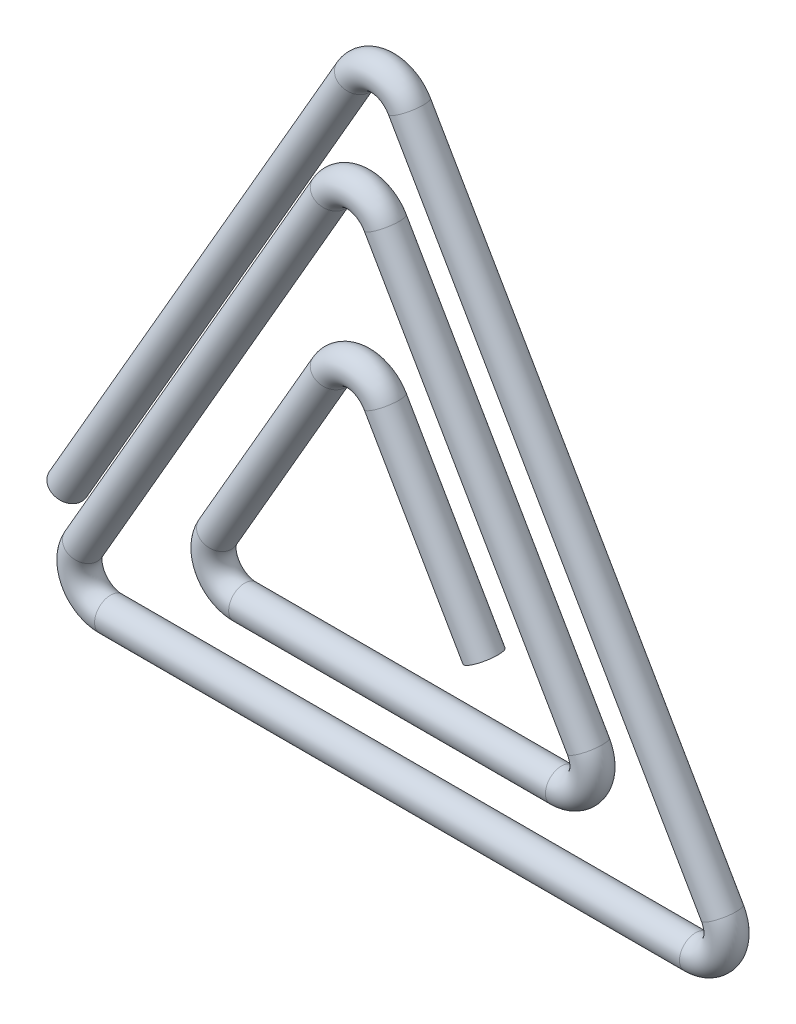
ISO-10303-21;
HEADER;
FILE_DESCRIPTION(('STEP AP214'),'2;1');
FILE_NAME('part.step','',(''),(''),'','','');
FILE_SCHEMA(('AUTOMOTIVE_DESIGN { 1 0 10303 214 1 1 1 1 }'));
ENDSEC;
DATA;
#1=APPLICATION_CONTEXT('core data for automotive mechanical design processes');
#2=APPLICATION_PROTOCOL_DEFINITION('international standard','automotive_design',2000,#1);
#3=PRODUCT_CONTEXT('',#1,'mechanical');
#4=PRODUCT('Part','Part','',(#3));
#5=PRODUCT_RELATED_PRODUCT_CATEGORY('part','',(#4));
#6=PRODUCT_DEFINITION_FORMATION('','',#4);
#7=PRODUCT_DEFINITION_CONTEXT('part definition',#1,'design');
#8=PRODUCT_DEFINITION('design','',#6,#7);
#9=PRODUCT_DEFINITION_SHAPE('','',#8);
#10=(LENGTH_UNIT() NAMED_UNIT(*) SI_UNIT(.MILLI.,.METRE.));
#11=(NAMED_UNIT(*) PLANE_ANGLE_UNIT() SI_UNIT($,.RADIAN.));
#12=(NAMED_UNIT(*) SI_UNIT($,.STERADIAN.) SOLID_ANGLE_UNIT());
#13=UNCERTAINTY_MEASURE_WITH_UNIT(LENGTH_MEASURE(1.E-05),#10,'distance_accuracy_value','');
#14=(GEOMETRIC_REPRESENTATION_CONTEXT(3) GLOBAL_UNCERTAINTY_ASSIGNED_CONTEXT((#13)) GLOBAL_UNIT_ASSIGNED_CONTEXT((#10,
#11,#12)) REPRESENTATION_CONTEXT('',''));
#15=CARTESIAN_POINT('',(0.,0.,0.));
#16=DIRECTION('',(0.,0.,1.));
#17=DIRECTION('',(1.,0.,0.));
#18=AXIS2_PLACEMENT_3D('',#15,#16,#17);
#19=CARTESIAN_POINT('',(-0.285699851987863,42.8448993027977,0.));
#20=DIRECTION('',(-0.5,-0.866025403784439,0.));
#21=DIRECTION('',(0.866025403784439,-0.5,0.));
#22=AXIS2_PLACEMENT_3D('',#19,#20,#21);
#23=CYLINDRICAL_SURFACE('',#22,1.65);
#24=CARTESIAN_POINT('',(-0.285699851987863,42.8448993027977,0.));
#25=DIRECTION('',(0.499999999999833,0.866025403784535,0.));
#26=DIRECTION('',(-0.866025403784535,0.499999999999833,0.));
#27=AXIS2_PLACEMENT_3D('',#24,#25,#26);
#28=CIRCLE('',#27,1.65);
#29=CARTESIAN_POINT('',(-1.7146417682322,43.6698993027977,0.));
#30=VERTEX_POINT('',#29);
#31=EDGE_CURVE('E38',#30,#30,#28,.T.);
#32=ORIENTED_EDGE('',*,*,#31,.F.);
#33=EDGE_LOOP('',(#32));
#34=FACE_BOUND('',#33,.T.);
#35=CARTESIAN_POINT('',(-30.,-8.6217782649107,0.));
#36=DIRECTION('',(0.499999999999833,0.866025403784535,0.));
#37=DIRECTION('',(-0.866025403784535,0.499999999999833,0.));
#38=AXIS2_PLACEMENT_3D('',#35,#36,#37);
#39=CIRCLE('',#38,1.65);
#40=CARTESIAN_POINT('',(-31.4289419162445,-7.79677826491098,0.));
#41=VERTEX_POINT('',#40);
#42=EDGE_CURVE('E10',#41,#41,#39,.T.);
#43=ORIENTED_EDGE('',*,*,#42,.T.);
#44=EDGE_LOOP('',(#43));
#45=FACE_BOUND('',#44,.T.);
#46=ADVANCED_FACE('F32',(#34,#45),#23,.T.);
#47=CARTESIAN_POINT('',(2.5,41.2365747433711,0.));
#48=DIRECTION('',(0.,0.,1.));
#49=DIRECTION('',(1.,0.,0.));
#50=AXIS2_PLACEMENT_3D('',#47,#48,#49);
#51=TOROIDAL_SURFACE('',#50,3.21664911885337,1.65);
#52=CARTESIAN_POINT('',(5.28569985198788,42.8448993027977,0.));
#53=DIRECTION('',(0.500000000000142,-0.866025403784357,0.));
#54=DIRECTION('',(0.866025403784357,0.500000000000142,0.));
#55=AXIS2_PLACEMENT_3D('',#52,#53,#54);
#56=CIRCLE('',#55,1.65);
#57=CARTESIAN_POINT('',(6.71464176823222,43.6698993027977,0.));
#58=VERTEX_POINT('',#57);
#59=EDGE_CURVE('E42',#58,#58,#56,.T.);
#60=CARTESIAN_POINT('',(2.5,41.2365747433711,0.));
#61=DIRECTION('',(0.,0.,1.));
#62=DIRECTION('',(1.,0.,0.));
#63=AXIS2_PLACEMENT_3D('',#60,#61,#62);
#64=CIRCLE('',#63,4.86664911885337);
#65=EDGE_CURVE('',#58,#30,#64,.T.);
#66=ORIENTED_EDGE('',*,*,#59,.F.);
#67=ORIENTED_EDGE('',*,*,#31,.T.);
#68=ORIENTED_EDGE('',*,*,#65,.T.);
#69=ORIENTED_EDGE('',*,*,#65,.F.);
#70=EDGE_LOOP('',(#66,#68,#67,#69));
#71=FACE_BOUND('',#70,.T.);
#72=ADVANCED_FACE('F160',(#71),#51,.T.);
#73=CARTESIAN_POINT('',(37.6288189912859,-13.1750263217199,0.));
#74=DIRECTION('',(-0.5,0.866025403784439,0.));
#75=DIRECTION('',(-0.866025403784439,-0.5,0.));
#76=AXIS2_PLACEMENT_3D('',#73,#74,#75);
#77=CYLINDRICAL_SURFACE('',#76,1.65);
#78=CARTESIAN_POINT('',(37.6288189912859,-13.1750263217199,0.));
#79=DIRECTION('',(0.500000000000142,-0.866025403784357,0.));
#80=DIRECTION('',(0.866025403784357,0.500000000000142,0.));
#81=AXIS2_PLACEMENT_3D('',#78,#79,#80);
#82=CIRCLE('',#81,1.65);
#83=CARTESIAN_POINT('',(39.0577609075303,-12.3500263217199,0.));
#84=VERTEX_POINT('',#83);
#85=EDGE_CURVE('E46',#84,#84,#82,.T.);
#86=ORIENTED_EDGE('',*,*,#85,.F.);
#87=EDGE_LOOP('',(#86));
#88=FACE_BOUND('',#87,.T.);
#89=ORIENTED_EDGE('',*,*,#59,.T.);
#90=EDGE_LOOP('',(#89));
#91=FACE_BOUND('',#90,.T.);
#92=ADVANCED_FACE('F154',(#88,#91),#77,.T.);
#93=CARTESIAN_POINT('',(34.8431191392981,-14.7833508811466,0.));
#94=DIRECTION('',(0.,0.,1.));
#95=DIRECTION('',(1.,0.,0.));
#96=AXIS2_PLACEMENT_3D('',#93,#94,#95);
#97=TOROIDAL_SURFACE('',#96,3.21664911885338,1.65);
#98=CARTESIAN_POINT('',(34.8431191392981,-18.,0.));
#99=DIRECTION('',(-1.,-1.38000721960907E-13,0.));
#100=DIRECTION('',(1.38000721960907E-13,-1.,0.));
#101=AXIS2_PLACEMENT_3D('',#98,#99,#100);
#102=CIRCLE('',#101,1.65);
#103=CARTESIAN_POINT('',(34.843119139298,-19.65,0.));
#104=VERTEX_POINT('',#103);
#105=EDGE_CURVE('E51',#104,#104,#102,.T.);
#106=CARTESIAN_POINT('',(34.8431191392981,-14.7833508811466,0.));
#107=DIRECTION('',(0.,0.,1.));
#108=DIRECTION('',(1.,0.,0.));
#109=AXIS2_PLACEMENT_3D('',#106,#107,#108);
#110=CIRCLE('',#109,4.86664911885338);
#111=EDGE_CURVE('',#104,#84,#110,.T.);
#112=ORIENTED_EDGE('',*,*,#105,.F.);
#113=ORIENTED_EDGE('',*,*,#85,.T.);
#114=ORIENTED_EDGE('',*,*,#111,.T.);
#115=ORIENTED_EDGE('',*,*,#111,.F.);
#116=EDGE_LOOP('',(#112,#114,#113,#115));
#117=FACE_BOUND('',#116,.T.);
#118=ADVANCED_FACE('F148',(#117),#97,.T.);
#119=CARTESIAN_POINT('',(-25.6055148322641,-18.,0.));
#120=DIRECTION('',(1.,0.,0.));
#121=DIRECTION('',(0.,1.,0.));
#122=AXIS2_PLACEMENT_3D('',#119,#120,#121);
#123=CYLINDRICAL_SURFACE('',#122,1.65);
#124=CARTESIAN_POINT('',(-25.6055148322641,-18.,0.));
#125=DIRECTION('',(-1.,-1.38000721960907E-13,0.));
#126=DIRECTION('',(1.38000721960907E-13,-1.,0.));
#127=AXIS2_PLACEMENT_3D('',#124,#125,#126);
#128=CIRCLE('',#127,1.65);
#129=CARTESIAN_POINT('',(-25.605514832264,-19.65,0.));
#130=VERTEX_POINT('',#129);
#131=EDGE_CURVE('E54',#130,#130,#128,.T.);
#132=ORIENTED_EDGE('',*,*,#131,.F.);
#133=EDGE_LOOP('',(#132));
#134=FACE_BOUND('',#133,.T.);
#135=ORIENTED_EDGE('',*,*,#105,.T.);
#136=EDGE_LOOP('',(#135));
#137=FACE_BOUND('',#136,.T.);
#138=ADVANCED_FACE('F142',(#134,#137),#123,.T.);
#139=CARTESIAN_POINT('',(-25.6055148322641,-14.7833508811466,0.));
#140=DIRECTION('',(0.,0.,1.));
#141=DIRECTION('',(1.,0.,0.));
#142=AXIS2_PLACEMENT_3D('',#139,#140,#141);
#143=TOROIDAL_SURFACE('',#142,3.21664911885337,1.65);
#144=CARTESIAN_POINT('',(-28.3912146842519,-13.1750263217199,0.));
#145=DIRECTION('',(0.499999999999905,0.866025403784494,0.));
#146=DIRECTION('',(-0.866025403784494,0.499999999999905,0.));
#147=AXIS2_PLACEMENT_3D('',#144,#145,#146);
#148=CIRCLE('',#147,1.65);
#149=CARTESIAN_POINT('',(-29.8201566004962,-12.3500263217199,0.));
#150=VERTEX_POINT('',#149);
#151=EDGE_CURVE('E57',#150,#150,#148,.T.);
#152=CARTESIAN_POINT('',(-25.6055148322641,-14.7833508811466,0.));
#153=DIRECTION('',(0.,0.,1.));
#154=DIRECTION('',(1.,0.,0.));
#155=AXIS2_PLACEMENT_3D('',#152,#153,#154);
#156=CIRCLE('',#155,4.86664911885337);
#157=EDGE_CURVE('',#150,#130,#156,.T.);
#158=ORIENTED_EDGE('',*,*,#151,.F.);
#159=ORIENTED_EDGE('',*,*,#131,.T.);
#160=ORIENTED_EDGE('',*,*,#157,.T.);
#161=ORIENTED_EDGE('',*,*,#157,.F.);
#162=EDGE_LOOP('',(#158,#160,#159,#161));
#163=FACE_BOUND('',#162,.T.);
#164=ADVANCED_FACE('F136',(#163),#143,.T.);
#165=CARTESIAN_POINT('',(-2.78569985198787,31.1750263217199,0.));
#166=DIRECTION('',(-0.5,-0.866025403784439,0.));
#167=DIRECTION('',(0.866025403784439,-0.5,0.));
#168=AXIS2_PLACEMENT_3D('',#165,#166,#167);
#169=CYLINDRICAL_SURFACE('',#168,1.65);
#170=CARTESIAN_POINT('',(-2.78569985198787,31.1750263217199,0.));
#171=DIRECTION('',(0.499999999999905,0.866025403784494,0.));
#172=DIRECTION('',(-0.866025403784494,0.499999999999905,0.));
#173=AXIS2_PLACEMENT_3D('',#170,#171,#172);
#174=CIRCLE('',#173,1.65);
#175=CARTESIAN_POINT('',(-4.2146417682322,32.0000263217199,0.));
#176=VERTEX_POINT('',#175);
#177=EDGE_CURVE('E60',#176,#176,#174,.T.);
#178=ORIENTED_EDGE('',*,*,#177,.F.);
#179=EDGE_LOOP('',(#178));
#180=FACE_BOUND('',#179,.T.);
#181=ORIENTED_EDGE('',*,*,#151,.T.);
#182=EDGE_LOOP('',(#181));
#183=FACE_BOUND('',#182,.T.);
#184=ADVANCED_FACE('F130',(#180,#183),#169,.T.);
#185=CARTESIAN_POINT('',(0.,29.5667017622932,0.));
#186=DIRECTION('',(0.,0.,1.));
#187=DIRECTION('',(1.,0.,0.));
#188=AXIS2_PLACEMENT_3D('',#185,#186,#187);
#189=TOROIDAL_SURFACE('',#188,3.21664911885337,1.65);
#190=CARTESIAN_POINT('',(2.78569985198788,31.1750263217199,0.));
#191=DIRECTION('',(0.500000000000072,-0.866025403784397,0.));
#192=DIRECTION('',(0.866025403784397,0.500000000000072,0.));
#193=AXIS2_PLACEMENT_3D('',#190,#191,#192);
#194=CIRCLE('',#193,1.65);
#195=CARTESIAN_POINT('',(4.21464176823221,32.0000263217199,0.));
#196=VERTEX_POINT('',#195);
#197=EDGE_CURVE('E63',#196,#196,#194,.T.);
#198=CARTESIAN_POINT('',(0.,29.5667017622932,0.));
#199=DIRECTION('',(0.,0.,1.));
#200=DIRECTION('',(1.,0.,0.));
#201=AXIS2_PLACEMENT_3D('',#198,#199,#200);
#202=CIRCLE('',#201,4.86664911885337);
#203=EDGE_CURVE('',#196,#176,#202,.T.);
#204=ORIENTED_EDGE('',*,*,#197,.F.);
#205=ORIENTED_EDGE('',*,*,#177,.T.);
#206=ORIENTED_EDGE('',*,*,#203,.T.);
#207=ORIENTED_EDGE('',*,*,#203,.F.);
#208=EDGE_LOOP('',(#204,#206,#205,#207));
#209=FACE_BOUND('',#208,.T.);
#210=ADVANCED_FACE('F124',(#209),#189,.T.);
#211=CARTESIAN_POINT('',(23.7724125307349,-5.17502632171991,0.));
#212=DIRECTION('',(-0.5,0.866025403784439,0.));
#213=DIRECTION('',(-0.866025403784439,-0.5,0.));
#214=AXIS2_PLACEMENT_3D('',#211,#212,#213);
#215=CYLINDRICAL_SURFACE('',#214,1.65);
#216=CARTESIAN_POINT('',(23.7724125307349,-5.17502632171991,0.));
#217=DIRECTION('',(0.500000000000072,-0.866025403784397,0.));
#218=DIRECTION('',(0.866025403784397,0.500000000000072,0.));
#219=AXIS2_PLACEMENT_3D('',#216,#217,#218);
#220=CIRCLE('',#219,1.65);
#221=CARTESIAN_POINT('',(25.2013544469792,-4.35002632171989,0.));
#222=VERTEX_POINT('',#221);
#223=EDGE_CURVE('E66',#222,#222,#220,.T.);
#224=ORIENTED_EDGE('',*,*,#223,.F.);
#225=EDGE_LOOP('',(#224));
#226=FACE_BOUND('',#225,.T.);
#227=ORIENTED_EDGE('',*,*,#197,.T.);
#228=EDGE_LOOP('',(#227));
#229=FACE_BOUND('',#228,.T.);
#230=ADVANCED_FACE('F118',(#226,#229),#215,.T.);
#231=CARTESIAN_POINT('',(20.9867126787471,-6.78335088114663,0.));
#232=DIRECTION('',(0.,0.,1.));
#233=DIRECTION('',(1.,0.,0.));
#234=AXIS2_PLACEMENT_3D('',#231,#232,#233);
#235=TOROIDAL_SURFACE('',#234,3.21664911885338,1.65);
#236=CARTESIAN_POINT('',(20.986712678747,-10.,0.));
#237=DIRECTION('',(-1.,0.,0.));
#238=DIRECTION('',(0.,-1.,0.));
#239=AXIS2_PLACEMENT_3D('',#236,#237,#238);
#240=CIRCLE('',#239,1.65);
#241=CARTESIAN_POINT('',(20.986712678747,-11.65,0.));
#242=VERTEX_POINT('',#241);
#243=EDGE_CURVE('E69',#242,#242,#240,.T.);
#244=CARTESIAN_POINT('',(20.9867126787471,-6.78335088114663,0.));
#245=DIRECTION('',(0.,0.,1.));
#246=DIRECTION('',(1.,0.,0.));
#247=AXIS2_PLACEMENT_3D('',#244,#245,#246);
#248=CIRCLE('',#247,4.86664911885338);
#249=EDGE_CURVE('',#242,#222,#248,.T.);
#250=ORIENTED_EDGE('',*,*,#243,.F.);
#251=ORIENTED_EDGE('',*,*,#223,.T.);
#252=ORIENTED_EDGE('',*,*,#249,.T.);
#253=ORIENTED_EDGE('',*,*,#249,.F.);
#254=EDGE_LOOP('',(#250,#252,#251,#253));
#255=FACE_BOUND('',#254,.T.);
#256=ADVANCED_FACE('F112',(#255),#235,.T.);
#257=CARTESIAN_POINT('',(-11.749108371713,-10.,0.));
#258=DIRECTION('',(1.,0.,0.));
#259=DIRECTION('',(0.,1.,0.));
#260=AXIS2_PLACEMENT_3D('',#257,#258,#259);
#261=CYLINDRICAL_SURFACE('',#260,1.65);
#262=CARTESIAN_POINT('',(-11.749108371713,-10.,0.));
#263=DIRECTION('',(-1.,0.,0.));
#264=DIRECTION('',(0.,-1.,0.));
#265=AXIS2_PLACEMENT_3D('',#262,#263,#264);
#266=CIRCLE('',#265,1.65);
#267=CARTESIAN_POINT('',(-11.749108371713,-11.65,0.));
#268=VERTEX_POINT('',#267);
#269=EDGE_CURVE('E72',#268,#268,#266,.T.);
#270=ORIENTED_EDGE('',*,*,#269,.F.);
#271=EDGE_LOOP('',(#270));
#272=FACE_BOUND('',#271,.T.);
#273=ORIENTED_EDGE('',*,*,#243,.T.);
#274=EDGE_LOOP('',(#273));
#275=FACE_BOUND('',#274,.T.);
#276=ADVANCED_FACE('F106',(#272,#275),#261,.T.);
#277=CARTESIAN_POINT('',(-11.7491083717131,-6.78335088114663,0.));
#278=DIRECTION('',(0.,0.,1.));
#279=DIRECTION('',(1.,0.,0.));
#280=AXIS2_PLACEMENT_3D('',#277,#278,#279);
#281=TOROIDAL_SURFACE('',#280,3.21664911885337,1.65);
#282=CARTESIAN_POINT('',(-14.5348082237009,-5.1750263217199,0.));
#283=DIRECTION('',(0.499999999999977,0.866025403784452,0.));
#284=DIRECTION('',(-0.866025403784452,0.499999999999977,0.));
#285=AXIS2_PLACEMENT_3D('',#282,#283,#284);
#286=CIRCLE('',#285,1.65);
#287=CARTESIAN_POINT('',(-15.9637501399452,-4.35002632171988,0.));
#288=VERTEX_POINT('',#287);
#289=EDGE_CURVE('E75',#288,#288,#286,.T.);
#290=CARTESIAN_POINT('',(-11.7491083717131,-6.78335088114663,0.));
#291=DIRECTION('',(0.,0.,1.));
#292=DIRECTION('',(1.,0.,0.));
#293=AXIS2_PLACEMENT_3D('',#290,#291,#292);
#294=CIRCLE('',#293,4.86664911885337);
#295=EDGE_CURVE('',#288,#268,#294,.T.);
#296=ORIENTED_EDGE('',*,*,#289,.F.);
#297=ORIENTED_EDGE('',*,*,#269,.T.);
#298=ORIENTED_EDGE('',*,*,#295,.T.);
#299=ORIENTED_EDGE('',*,*,#295,.F.);
#300=EDGE_LOOP('',(#296,#298,#297,#299));
#301=FACE_BOUND('',#300,.T.);
#302=ADVANCED_FACE('F100',(#301),#281,.T.);
#303=CARTESIAN_POINT('',(-2.78569985198787,15.1750263217199,0.));
#304=DIRECTION('',(-0.5,-0.866025403784439,0.));
#305=DIRECTION('',(0.866025403784439,-0.5,0.));
#306=AXIS2_PLACEMENT_3D('',#303,#304,#305);
#307=CYLINDRICAL_SURFACE('',#306,1.65);
#308=CARTESIAN_POINT('',(-2.78569985198787,15.1750263217199,0.));
#309=DIRECTION('',(0.499999999999977,0.866025403784452,0.));
#310=DIRECTION('',(-0.866025403784452,0.499999999999977,0.));
#311=AXIS2_PLACEMENT_3D('',#308,#309,#310);
#312=CIRCLE('',#311,1.65);
#313=CARTESIAN_POINT('',(-4.2146417682322,16.0000263217199,0.));
#314=VERTEX_POINT('',#313);
#315=EDGE_CURVE('E78',#314,#314,#312,.T.);
#316=ORIENTED_EDGE('',*,*,#315,.F.);
#317=EDGE_LOOP('',(#316));
#318=FACE_BOUND('',#317,.T.);
#319=ORIENTED_EDGE('',*,*,#289,.T.);
#320=EDGE_LOOP('',(#319));
#321=FACE_BOUND('',#320,.T.);
#322=ADVANCED_FACE('F94',(#318,#321),#307,.T.);
#323=CARTESIAN_POINT('',(0.,13.5667017622933,0.));
#324=DIRECTION('',(0.,0.,1.));
#325=DIRECTION('',(1.,0.,0.));
#326=AXIS2_PLACEMENT_3D('',#323,#324,#325);
#327=TOROIDAL_SURFACE('',#326,3.21664911885337,1.65);
#328=CARTESIAN_POINT('',(2.78569985198787,15.1750263217199,0.));
#329=DIRECTION('',(0.5,-0.866025403784439,0.));
#330=DIRECTION('',(0.866025403784439,0.5,0.));
#331=AXIS2_PLACEMENT_3D('',#328,#329,#330);
#332=CIRCLE('',#331,1.65);
#333=CARTESIAN_POINT('',(4.21464176823221,16.0000263217199,0.));
#334=VERTEX_POINT('',#333);
#335=EDGE_CURVE('E81',#334,#334,#332,.T.);
#336=CARTESIAN_POINT('',(0.,13.5667017622933,0.));
#337=DIRECTION('',(0.,0.,1.));
#338=DIRECTION('',(1.,0.,0.));
#339=AXIS2_PLACEMENT_3D('',#336,#337,#338);
#340=CIRCLE('',#339,4.86664911885337);
#341=EDGE_CURVE('',#334,#314,#340,.T.);
#342=ORIENTED_EDGE('',*,*,#335,.F.);
#343=ORIENTED_EDGE('',*,*,#315,.T.);
#344=ORIENTED_EDGE('',*,*,#341,.T.);
#345=ORIENTED_EDGE('',*,*,#341,.F.);
#346=EDGE_LOOP('',(#342,#344,#343,#345));
#347=FACE_BOUND('',#346,.T.);
#348=ADVANCED_FACE('F91',(#347),#327,.T.);
#349=CARTESIAN_POINT('',(2.78569985198787,15.1750263217199,0.));
#350=DIRECTION('',(0.5,-0.866025403784439,0.));
#351=DIRECTION('',(0.866025403784439,0.5,0.));
#352=AXIS2_PLACEMENT_3D('',#349,#350,#351);
#353=CYLINDRICAL_SURFACE('',#352,1.65);
#354=ORIENTED_EDGE('',*,*,#335,.T.);
#355=EDGE_LOOP('',(#354));
#356=FACE_BOUND('',#355,.T.);
#357=CARTESIAN_POINT('',(13.,-2.5166604983954,0.));
#358=DIRECTION('',(0.5,-0.866025403784439,0.));
#359=DIRECTION('',(0.866025403784439,0.5,0.));
#360=AXIS2_PLACEMENT_3D('',#357,#358,#359);
#361=CIRCLE('',#360,1.65);
#362=CARTESIAN_POINT('',(14.4289419162443,-1.6916604983954,0.));
#363=VERTEX_POINT('',#362);
#364=EDGE_CURVE('E82',#363,#363,#361,.T.);
#365=ORIENTED_EDGE('',*,*,#364,.F.);
#366=EDGE_LOOP('',(#365));
#367=FACE_BOUND('',#366,.T.);
#368=ADVANCED_FACE('F88',(#356,#367),#353,.T.);
#369=CARTESIAN_POINT('',(-30.,-8.6217782649107,0.));
#370=DIRECTION('',(0.499999999999833,0.866025403784535,0.));
#371=DIRECTION('',(-0.866025403784535,0.499999999999833,0.));
#372=AXIS2_PLACEMENT_3D('',#369,#370,#371);
#373=PLANE('',#372);
#374=ORIENTED_EDGE('',*,*,#42,.F.);
#375=EDGE_LOOP('',(#374));
#376=FACE_BOUND('',#375,.T.);
#377=ADVANCED_FACE('F172',(#376),#373,.F.);
#378=CARTESIAN_POINT('',(13.,-2.5166604983954,0.));
#379=DIRECTION('',(0.5,-0.866025403784439,0.));
#380=DIRECTION('',(0.866025403784439,0.5,0.));
#381=AXIS2_PLACEMENT_3D('',#378,#379,#380);
#382=PLANE('',#381);
#383=ORIENTED_EDGE('',*,*,#364,.T.);
#384=EDGE_LOOP('',(#383));
#385=FACE_BOUND('',#384,.T.);
#386=ADVANCED_FACE('F173',(#385),#382,.T.);
#387=CLOSED_SHELL('',(#46,#72,#92,#118,#138,#164,#184,#210,#230,#256,#276,#302,#322,#348,#368,
#377,#386));
#388=MANIFOLD_SOLID_BREP('B2',#387);
#389=ADVANCED_BREP_SHAPE_REPRESENTATION('',(#18,#388),#14);
#390=SHAPE_DEFINITION_REPRESENTATION(#9,#389);
ENDSEC;
END-ISO-10303-21;
